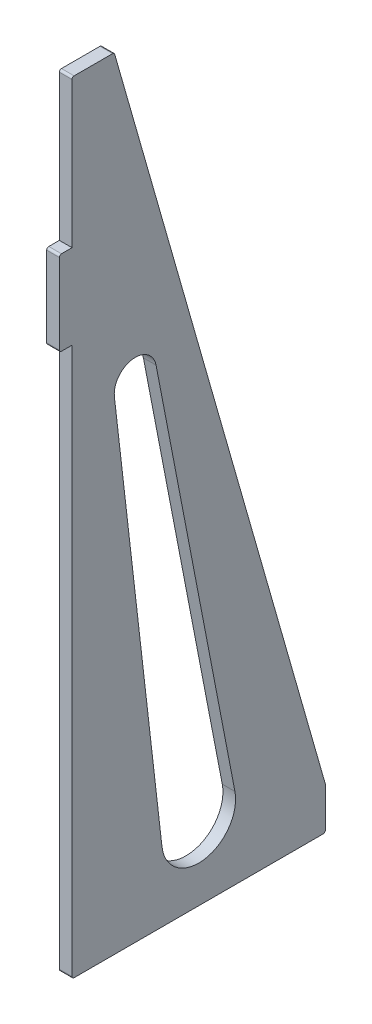
ISO-10303-21;
HEADER;
FILE_DESCRIPTION(('STEP AP214'),'2;1');
FILE_NAME('part.step','',(''),(''),'','','');
FILE_SCHEMA(('AUTOMOTIVE_DESIGN { 1 0 10303 214 1 1 1 1 }'));
ENDSEC;
DATA;
#1=APPLICATION_CONTEXT('core data for automotive mechanical design processes');
#2=APPLICATION_PROTOCOL_DEFINITION('international standard','automotive_design',2000,#1);
#3=PRODUCT_CONTEXT('',#1,'mechanical');
#4=PRODUCT('Part','Part','',(#3));
#5=PRODUCT_RELATED_PRODUCT_CATEGORY('part','',(#4));
#6=PRODUCT_DEFINITION_FORMATION('','',#4);
#7=PRODUCT_DEFINITION_CONTEXT('part definition',#1,'design');
#8=PRODUCT_DEFINITION('design','',#6,#7);
#9=PRODUCT_DEFINITION_SHAPE('','',#8);
#10=(LENGTH_UNIT() NAMED_UNIT(*) SI_UNIT(.MILLI.,.METRE.));
#11=(NAMED_UNIT(*) PLANE_ANGLE_UNIT() SI_UNIT($,.RADIAN.));
#12=(NAMED_UNIT(*) SI_UNIT($,.STERADIAN.) SOLID_ANGLE_UNIT());
#13=UNCERTAINTY_MEASURE_WITH_UNIT(LENGTH_MEASURE(1.E-05),#10,'distance_accuracy_value','');
#14=(GEOMETRIC_REPRESENTATION_CONTEXT(3) GLOBAL_UNCERTAINTY_ASSIGNED_CONTEXT((#13)) GLOBAL_UNIT_ASSIGNED_CONTEXT((#10,
#11,#12)) REPRESENTATION_CONTEXT('',''));
#15=CARTESIAN_POINT('',(0.,0.,0.));
#16=DIRECTION('',(0.,0.,1.));
#17=DIRECTION('',(1.,0.,0.));
#18=AXIS2_PLACEMENT_3D('',#15,#16,#17);
#19=CARTESIAN_POINT('',(6.,0.,-126.));
#20=DIRECTION('',(0.,1.,0.));
#21=DIRECTION('',(0.,0.,1.));
#22=AXIS2_PLACEMENT_3D('',#19,#20,#21);
#23=PLANE('',#22);
#24=DIRECTION('',(0.,0.,-1.));
#25=VECTOR('',#24,1.);
#26=CARTESIAN_POINT('',(0.,0.,-126.));
#27=LINE('',#26,#25);
#28=CARTESIAN_POINT('',(0.,0.,-7.00000000000005));
#29=VERTEX_POINT('',#28);
#30=CARTESIAN_POINT('',(0.,0.,-125.));
#31=VERTEX_POINT('',#30);
#32=EDGE_CURVE('E219',#29,#31,#27,.T.);
#33=ORIENTED_EDGE('',*,*,#32,.T.);
#34=DIRECTION('',(-1.,0.,0.));
#35=VECTOR('',#34,1.);
#36=CARTESIAN_POINT('',(6.,0.,-125.));
#37=LINE('',#36,#35);
#38=CARTESIAN_POINT('',(6.,0.,-125.));
#39=VERTEX_POINT('',#38);
#40=EDGE_CURVE('E299',#31,#39,#37,.F.);
#41=ORIENTED_EDGE('',*,*,#40,.T.);
#42=DIRECTION('',(0.,0.,-1.));
#43=VECTOR('',#42,1.);
#44=CARTESIAN_POINT('',(6.,0.,-126.));
#45=LINE('',#44,#43);
#46=CARTESIAN_POINT('',(6.,0.,-7.00000000000005));
#47=VERTEX_POINT('',#46);
#48=EDGE_CURVE('E220',#47,#39,#45,.T.);
#49=ORIENTED_EDGE('',*,*,#48,.F.);
#50=DIRECTION('',(1.,0.,0.));
#51=VECTOR('',#50,1.);
#52=CARTESIAN_POINT('',(6.,0.,-7.00000000000005));
#53=LINE('',#52,#51);
#54=EDGE_CURVE('E297',#47,#29,#53,.F.);
#55=ORIENTED_EDGE('',*,*,#54,.T.);
#56=EDGE_LOOP('',(#33,#41,#49,#55));
#57=FACE_BOUND('',#56,.T.);
#58=ADVANCED_FACE('F31',(#57),#23,.F.);
#59=CARTESIAN_POINT('',(6.,20.,-126.));
#60=DIRECTION('',(0.,0.,1.));
#61=DIRECTION('',(1.,0.,0.));
#62=AXIS2_PLACEMENT_3D('',#59,#60,#61);
#63=PLANE('',#62);
#64=DIRECTION('',(0.,1.,0.));
#65=VECTOR('',#64,1.);
#66=CARTESIAN_POINT('',(0.,20.,-126.));
#67=LINE('',#66,#65);
#68=CARTESIAN_POINT('',(0.,1.,-126.));
#69=VERTEX_POINT('',#68);
#70=CARTESIAN_POINT('',(0.,19.8599450553598,-126.));
#71=VERTEX_POINT('',#70);
#72=EDGE_CURVE('E239',#69,#71,#67,.T.);
#73=ORIENTED_EDGE('',*,*,#72,.T.);
#74=DIRECTION('',(-1.,0.,0.));
#75=VECTOR('',#74,1.);
#76=CARTESIAN_POINT('',(6.,19.8599450553598,-126.));
#77=LINE('',#76,#75);
#78=CARTESIAN_POINT('',(6.,19.8599450553598,-126.));
#79=VERTEX_POINT('',#78);
#80=EDGE_CURVE('E281',#71,#79,#77,.F.);
#81=ORIENTED_EDGE('',*,*,#80,.T.);
#82=DIRECTION('',(0.,1.,0.));
#83=VECTOR('',#82,1.);
#84=CARTESIAN_POINT('',(6.,20.,-126.));
#85=LINE('',#84,#83);
#86=CARTESIAN_POINT('',(6.,1.,-126.));
#87=VERTEX_POINT('',#86);
#88=EDGE_CURVE('E223',#87,#79,#85,.T.);
#89=ORIENTED_EDGE('',*,*,#88,.F.);
#90=DIRECTION('',(-1.,0.,0.));
#91=VECTOR('',#90,1.);
#92=CARTESIAN_POINT('',(6.,1.,-126.));
#93=LINE('',#92,#91);
#94=EDGE_CURVE('E278',#87,#69,#93,.T.);
#95=ORIENTED_EDGE('',*,*,#94,.T.);
#96=EDGE_LOOP('',(#73,#81,#89,#95));
#97=FACE_BOUND('',#96,.T.);
#98=ADVANCED_FACE('F344',(#97),#63,.F.);
#99=CARTESIAN_POINT('',(6.,370.,-26.));
#100=DIRECTION('',(0.,-0.274721127897378,0.961523947640823));
#101=DIRECTION('',(0.,-0.961523947640823,-0.274721127897378));
#102=AXIS2_PLACEMENT_3D('',#99,#100,#101);
#103=PLANE('',#102);
#104=DIRECTION('',(0.,0.961523947640823,0.274721127897378));
#105=VECTOR('',#104,1.);
#106=CARTESIAN_POINT('',(6.,370.,-26.));
#107=LINE('',#106,#105);
#108=CARTESIAN_POINT('',(6.,20.1346661832571,-125.961523947641));
#109=VERTEX_POINT('',#108);
#110=CARTESIAN_POINT('',(6.,369.274721127897,-26.2072225348865));
#111=VERTEX_POINT('',#110);
#112=EDGE_CURVE('E227',#109,#111,#107,.T.);
#113=ORIENTED_EDGE('',*,*,#112,.F.);
#114=DIRECTION('',(-1.,0.,0.));
#115=VECTOR('',#114,1.);
#116=CARTESIAN_POINT('',(6.,20.1346661832572,-125.961523947641));
#117=LINE('',#116,#115);
#118=CARTESIAN_POINT('',(0.,20.1346661832571,-125.961523947641));
#119=VERTEX_POINT('',#118);
#120=EDGE_CURVE('E261',#109,#119,#117,.T.);
#121=ORIENTED_EDGE('',*,*,#120,.T.);
#122=DIRECTION('',(0.,0.961523947640823,0.274721127897378));
#123=VECTOR('',#122,1.);
#124=CARTESIAN_POINT('',(0.,370.,-26.));
#125=LINE('',#124,#123);
#126=CARTESIAN_POINT('',(0.,369.274721127897,-26.2072225348865));
#127=VERTEX_POINT('',#126);
#128=EDGE_CURVE('E242',#119,#127,#125,.T.);
#129=ORIENTED_EDGE('',*,*,#128,.T.);
#130=DIRECTION('',(-1.,0.,0.));
#131=VECTOR('',#130,1.);
#132=CARTESIAN_POINT('',(6.,369.274721127897,-26.2072225348865));
#133=LINE('',#132,#131);
#134=EDGE_CURVE('E259',#127,#111,#133,.F.);
#135=ORIENTED_EDGE('',*,*,#134,.T.);
#136=EDGE_LOOP('',(#113,#121,#129,#135));
#137=FACE_BOUND('',#136,.T.);
#138=ADVANCED_FACE('F338',(#137),#103,.F.);
#139=CARTESIAN_POINT('',(6.,370.,0.));
#140=DIRECTION('',(0.,-1.,0.));
#141=DIRECTION('',(0.,0.,-1.));
#142=AXIS2_PLACEMENT_3D('',#139,#140,#141);
#143=PLANE('',#142);
#144=DIRECTION('',(0.,0.,1.));
#145=VECTOR('',#144,1.);
#146=CARTESIAN_POINT('',(6.,370.,0.));
#147=LINE('',#146,#145);
#148=CARTESIAN_POINT('',(6.,370.,-25.2456985872456));
#149=VERTEX_POINT('',#148);
#150=CARTESIAN_POINT('',(6.,370.,-7.));
#151=VERTEX_POINT('',#150);
#152=EDGE_CURVE('E230',#149,#151,#147,.T.);
#153=ORIENTED_EDGE('',*,*,#152,.F.);
#154=DIRECTION('',(-1.,0.,0.));
#155=VECTOR('',#154,1.);
#156=CARTESIAN_POINT('',(6.,370.,-25.2456985872456));
#157=LINE('',#156,#155);
#158=CARTESIAN_POINT('',(0.,370.,-25.2456985872456));
#159=VERTEX_POINT('',#158);
#160=EDGE_CURVE('E39',#149,#159,#157,.T.);
#161=ORIENTED_EDGE('',*,*,#160,.T.);
#162=DIRECTION('',(0.,0.,1.));
#163=VECTOR('',#162,1.);
#164=CARTESIAN_POINT('',(0.,370.,0.));
#165=LINE('',#164,#163);
#166=CARTESIAN_POINT('',(0.,370.,-7.));
#167=VERTEX_POINT('',#166);
#168=EDGE_CURVE('E245',#159,#167,#165,.T.);
#169=ORIENTED_EDGE('',*,*,#168,.T.);
#170=DIRECTION('',(1.,0.,0.));
#171=VECTOR('',#170,1.);
#172=CARTESIAN_POINT('',(6.,370.,-7.));
#173=LINE('',#172,#171);
#174=EDGE_CURVE('E314',#167,#151,#173,.T.);
#175=ORIENTED_EDGE('',*,*,#174,.T.);
#176=EDGE_LOOP('',(#153,#161,#169,#175));
#177=FACE_BOUND('',#176,.T.);
#178=ADVANCED_FACE('F321',(#177),#143,.F.);
#179=CARTESIAN_POINT('',(6.,0.,0.));
#180=DIRECTION('',(0.,0.,-1.));
#181=DIRECTION('',(-1.,0.,0.));
#182=AXIS2_PLACEMENT_3D('',#179,#180,#181);
#183=PLANE('',#182);
#184=DIRECTION('',(0.,-1.,0.));
#185=VECTOR('',#184,1.);
#186=CARTESIAN_POINT('',(0.,0.,0.));
#187=LINE('',#186,#185);
#188=CARTESIAN_POINT('',(0.,299.,0.));
#189=VERTEX_POINT('',#188);
#190=CARTESIAN_POINT('',(0.,261.,0.));
#191=VERTEX_POINT('',#190);
#192=EDGE_CURVE('E224',#189,#191,#187,.T.);
#193=ORIENTED_EDGE('',*,*,#192,.T.);
#194=DIRECTION('',(1.,0.,0.));
#195=VECTOR('',#194,1.);
#196=CARTESIAN_POINT('',(6.,261.,0.));
#197=LINE('',#196,#195);
#198=CARTESIAN_POINT('',(6.,261.,0.));
#199=VERTEX_POINT('',#198);
#200=EDGE_CURVE('E306',#191,#199,#197,.T.);
#201=ORIENTED_EDGE('',*,*,#200,.T.);
#202=DIRECTION('',(0.,-1.,0.));
#203=VECTOR('',#202,1.);
#204=CARTESIAN_POINT('',(6.,0.,0.));
#205=LINE('',#204,#203);
#206=CARTESIAN_POINT('',(6.,299.,0.));
#207=VERTEX_POINT('',#206);
#208=EDGE_CURVE('E233',#207,#199,#205,.T.);
#209=ORIENTED_EDGE('',*,*,#208,.F.);
#210=DIRECTION('',(1.,0.,0.));
#211=VECTOR('',#210,1.);
#212=CARTESIAN_POINT('',(6.,299.,0.));
#213=LINE('',#212,#211);
#214=EDGE_CURVE('E304',#207,#189,#213,.F.);
#215=ORIENTED_EDGE('',*,*,#214,.T.);
#216=EDGE_LOOP('',(#193,#201,#209,#215));
#217=FACE_BOUND('',#216,.T.);
#218=ADVANCED_FACE('F377',(#217),#183,.F.);
#219=CARTESIAN_POINT('',(6.,0.,0.));
#220=DIRECTION('',(-1.,0.,0.));
#221=DIRECTION('',(0.,0.,1.));
#222=AXIS2_PLACEMENT_3D('',#219,#220,#221);
#223=PLANE('',#222);
#224=DIRECTION('',(0.,0.981876951244127,0.189519530960635));
#225=VECTOR('',#224,1.);
#226=CARTESIAN_POINT('',(6.,231.895195309606,-45.8187695124413));
#227=LINE('',#226,#225);
#228=CARTESIAN_POINT('',(6.,38.3165917918111,-83.1828466467722));
#229=VERTEX_POINT('',#228);
#230=CARTESIAN_POINT('',(6.,231.895195309606,-45.8187695124413));
#231=VERTEX_POINT('',#230);
#232=EDGE_CURVE('E194',#229,#231,#227,.T.);
#233=ORIENTED_EDGE('',*,*,#232,.F.);
#234=CARTESIAN_POINT('',(6.,35.,-66.));
#235=DIRECTION('',(1.,0.,0.));
#236=DIRECTION('',(0.,0.,1.));
#237=AXIS2_PLACEMENT_3D('',#234,#235,#236);
#238=CIRCLE('',#237,17.5);
#239=CARTESIAN_POINT('',(6.,32.998437109923,-48.6148412144994));
#240=VERTEX_POINT('',#239);
#241=EDGE_CURVE('E46',#240,#229,#238,.T.);
#242=ORIENTED_EDGE('',*,*,#241,.F.);
#243=DIRECTION('',(0.,-0.993437644885745,-0.114375022290115));
#244=VECTOR('',#243,1.);
#245=CARTESIAN_POINT('',(6.,228.856249777099,-26.0656235511425));
#246=LINE('',#245,#244);
#247=CARTESIAN_POINT('',(6.,228.856249777099,-26.0656235511425));
#248=VERTEX_POINT('',#247);
#249=EDGE_CURVE('E185',#248,#240,#246,.T.);
#250=ORIENTED_EDGE('',*,*,#249,.F.);
#251=CARTESIAN_POINT('',(6.,230.,-36.));
#252=DIRECTION('',(1.,0.,0.));
#253=DIRECTION('',(0.,0.,1.));
#254=AXIS2_PLACEMENT_3D('',#251,#252,#253);
#255=CIRCLE('',#254,10.);
#256=EDGE_CURVE('E188',#231,#248,#255,.T.);
#257=ORIENTED_EDGE('',*,*,#256,.F.);
#258=EDGE_LOOP('',(#233,#242,#250,#257));
#259=FACE_BOUND('',#258,.T.);
#260=ORIENTED_EDGE('',*,*,#88,.T.);
#261=CARTESIAN_POINT('',(6.,19.8599450553598,-125.));
#262=DIRECTION('',(-1.,0.,0.));
#263=DIRECTION('',(0.,0.,1.));
#264=AXIS2_PLACEMENT_3D('',#261,#262,#263);
#265=CIRCLE('',#264,1.);
#266=EDGE_CURVE('E295',#79,#109,#265,.F.);
#267=ORIENTED_EDGE('',*,*,#266,.T.);
#268=ORIENTED_EDGE('',*,*,#112,.T.);
#269=CARTESIAN_POINT('',(6.,369.,-25.2456985872456));
#270=DIRECTION('',(-1.,0.,0.));
#271=DIRECTION('',(0.,0.,1.));
#272=AXIS2_PLACEMENT_3D('',#269,#270,#271);
#273=CIRCLE('',#272,1.);
#274=EDGE_CURVE('E285',#111,#149,#273,.F.);
#275=ORIENTED_EDGE('',*,*,#274,.T.);
#276=ORIENTED_EDGE('',*,*,#152,.T.);
#277=CARTESIAN_POINT('',(6.,369.,-7.));
#278=DIRECTION('',(-1.,0.,0.));
#279=DIRECTION('',(0.,0.,1.));
#280=AXIS2_PLACEMENT_3D('',#277,#278,#279);
#281=CIRCLE('',#280,1.);
#282=CARTESIAN_POINT('',(6.,369.,-6.));
#283=VERTEX_POINT('',#282);
#284=EDGE_CURVE('E283',#151,#283,#281,.F.);
#285=ORIENTED_EDGE('',*,*,#284,.T.);
#286=DIRECTION('',(0.,1.,0.));
#287=VECTOR('',#286,1.);
#288=CARTESIAN_POINT('',(6.,370.,-6.));
#289=LINE('',#288,#287);
#290=CARTESIAN_POINT('',(6.,300.,-6.00000000000001));
#291=VERTEX_POINT('',#290);
#292=EDGE_CURVE('E213',#291,#283,#289,.T.);
#293=ORIENTED_EDGE('',*,*,#292,.F.);
#294=DIRECTION('',(0.,0.,-1.));
#295=VECTOR('',#294,1.);
#296=CARTESIAN_POINT('',(6.,300.,-6.00000000000001));
#297=LINE('',#296,#295);
#298=CARTESIAN_POINT('',(6.,300.,-1.));
#299=VERTEX_POINT('',#298);
#300=EDGE_CURVE('E211',#299,#291,#297,.T.);
#301=ORIENTED_EDGE('',*,*,#300,.F.);
#302=CARTESIAN_POINT('',(6.,299.,-1.));
#303=DIRECTION('',(-1.,0.,0.));
#304=DIRECTION('',(0.,0.,1.));
#305=AXIS2_PLACEMENT_3D('',#302,#303,#304);
#306=CIRCLE('',#305,1.);
#307=EDGE_CURVE('E287',#299,#207,#306,.F.);
#308=ORIENTED_EDGE('',*,*,#307,.T.);
#309=ORIENTED_EDGE('',*,*,#208,.T.);
#310=CARTESIAN_POINT('',(6.,261.,-1.));
#311=DIRECTION('',(-1.,0.,0.));
#312=DIRECTION('',(0.,0.,1.));
#313=AXIS2_PLACEMENT_3D('',#310,#311,#312);
#314=CIRCLE('',#313,1.);
#315=CARTESIAN_POINT('',(6.,260.,-1.));
#316=VERTEX_POINT('',#315);
#317=EDGE_CURVE('E289',#199,#316,#314,.F.);
#318=ORIENTED_EDGE('',*,*,#317,.T.);
#319=DIRECTION('',(0.,0.,1.));
#320=VECTOR('',#319,1.);
#321=CARTESIAN_POINT('',(6.,260.,0.));
#322=LINE('',#321,#320);
#323=CARTESIAN_POINT('',(6.,260.,-6.00000000000001));
#324=VERTEX_POINT('',#323);
#325=EDGE_CURVE('E205',#324,#316,#322,.T.);
#326=ORIENTED_EDGE('',*,*,#325,.F.);
#327=DIRECTION('',(0.,1.,0.));
#328=VECTOR('',#327,1.);
#329=CARTESIAN_POINT('',(6.,260.,-6.00000000000001));
#330=LINE('',#329,#328);
#331=CARTESIAN_POINT('',(6.,1.,-6.00000000000004));
#332=VERTEX_POINT('',#331);
#333=EDGE_CURVE('E200',#332,#324,#330,.T.);
#334=ORIENTED_EDGE('',*,*,#333,.F.);
#335=CARTESIAN_POINT('',(6.,1.,-7.00000000000004));
#336=DIRECTION('',(-1.,0.,0.));
#337=DIRECTION('',(0.,0.,1.));
#338=AXIS2_PLACEMENT_3D('',#335,#336,#337);
#339=CIRCLE('',#338,1.);
#340=EDGE_CURVE('E291',#332,#47,#339,.F.);
#341=ORIENTED_EDGE('',*,*,#340,.T.);
#342=ORIENTED_EDGE('',*,*,#48,.T.);
#343=CARTESIAN_POINT('',(6.,1.,-125.));
#344=DIRECTION('',(-1.,0.,0.));
#345=DIRECTION('',(0.,0.,1.));
#346=AXIS2_PLACEMENT_3D('',#343,#344,#345);
#347=CIRCLE('',#346,1.);
#348=EDGE_CURVE('E293',#39,#87,#347,.F.);
#349=ORIENTED_EDGE('',*,*,#348,.T.);
#350=EDGE_LOOP('',(#260,#267,#268,#275,#276,#285,#293,#301,#308,#309,#318,#326,#334,#341,#342,#349));
#351=FACE_BOUND('',#350,.T.);
#352=ADVANCED_FACE('F332',(#259,#351),#223,.F.);
#353=CARTESIAN_POINT('',(0.,0.,0.));
#354=DIRECTION('',(-1.,0.,0.));
#355=DIRECTION('',(0.,0.,1.));
#356=AXIS2_PLACEMENT_3D('',#353,#354,#355);
#357=PLANE('',#356);
#358=CARTESIAN_POINT('',(0.,35.,-66.));
#359=DIRECTION('',(1.,0.,0.));
#360=DIRECTION('',(0.,0.,1.));
#361=AXIS2_PLACEMENT_3D('',#358,#359,#360);
#362=CIRCLE('',#361,17.5);
#363=CARTESIAN_POINT('',(0.,32.998437109923,-48.6148412144994));
#364=VERTEX_POINT('',#363);
#365=CARTESIAN_POINT('',(0.,38.3165917918111,-83.1828466467722));
#366=VERTEX_POINT('',#365);
#367=EDGE_CURVE('E169',#364,#366,#362,.T.);
#368=ORIENTED_EDGE('',*,*,#367,.T.);
#369=DIRECTION('',(0.,0.981876951244127,0.189519530960635));
#370=VECTOR('',#369,1.);
#371=CARTESIAN_POINT('',(0.,231.895195309606,-45.8187695124413));
#372=LINE('',#371,#370);
#373=CARTESIAN_POINT('',(0.,231.895195309606,-45.8187695124413));
#374=VERTEX_POINT('',#373);
#375=EDGE_CURVE('E178',#366,#374,#372,.T.);
#376=ORIENTED_EDGE('',*,*,#375,.T.);
#377=CARTESIAN_POINT('',(0.,230.,-36.));
#378=DIRECTION('',(1.,0.,0.));
#379=DIRECTION('',(0.,0.,1.));
#380=AXIS2_PLACEMENT_3D('',#377,#378,#379);
#381=CIRCLE('',#380,10.);
#382=CARTESIAN_POINT('',(0.,228.856249777099,-26.0656235511425));
#383=VERTEX_POINT('',#382);
#384=EDGE_CURVE('E54',#374,#383,#381,.T.);
#385=ORIENTED_EDGE('',*,*,#384,.T.);
#386=DIRECTION('',(0.,-0.993437644885745,-0.114375022290115));
#387=VECTOR('',#386,1.);
#388=CARTESIAN_POINT('',(0.,228.856249777099,-26.0656235511425));
#389=LINE('',#388,#387);
#390=EDGE_CURVE('E175',#383,#364,#389,.T.);
#391=ORIENTED_EDGE('',*,*,#390,.T.);
#392=EDGE_LOOP('',(#368,#376,#385,#391));
#393=FACE_BOUND('',#392,.T.);
#394=ORIENTED_EDGE('',*,*,#128,.F.);
#395=CARTESIAN_POINT('',(0.,19.8599450553598,-125.));
#396=DIRECTION('',(-1.,0.,0.));
#397=DIRECTION('',(0.,0.,1.));
#398=AXIS2_PLACEMENT_3D('',#395,#396,#397);
#399=CIRCLE('',#398,1.);
#400=EDGE_CURVE('E276',#119,#71,#399,.T.);
#401=ORIENTED_EDGE('',*,*,#400,.T.);
#402=ORIENTED_EDGE('',*,*,#72,.F.);
#403=CARTESIAN_POINT('',(0.,1.,-125.));
#404=DIRECTION('',(-1.,0.,0.));
#405=DIRECTION('',(0.,0.,1.));
#406=AXIS2_PLACEMENT_3D('',#403,#404,#405);
#407=CIRCLE('',#406,1.);
#408=EDGE_CURVE('E274',#69,#31,#407,.T.);
#409=ORIENTED_EDGE('',*,*,#408,.T.);
#410=ORIENTED_EDGE('',*,*,#32,.F.);
#411=CARTESIAN_POINT('',(0.,1.,-7.00000000000004));
#412=DIRECTION('',(-1.,0.,0.));
#413=DIRECTION('',(0.,0.,1.));
#414=AXIS2_PLACEMENT_3D('',#411,#412,#413);
#415=CIRCLE('',#414,1.);
#416=CARTESIAN_POINT('',(0.,1.,-6.00000000000004));
#417=VERTEX_POINT('',#416);
#418=EDGE_CURVE('E272',#29,#417,#415,.T.);
#419=ORIENTED_EDGE('',*,*,#418,.T.);
#420=DIRECTION('',(0.,-1.,0.));
#421=VECTOR('',#420,1.);
#422=CARTESIAN_POINT('',(0.,0.,-6.00000000000004));
#423=LINE('',#422,#421);
#424=CARTESIAN_POINT('',(0.,260.,-6.00000000000001));
#425=VERTEX_POINT('',#424);
#426=EDGE_CURVE('E254',#425,#417,#423,.T.);
#427=ORIENTED_EDGE('',*,*,#426,.F.);
#428=DIRECTION('',(0.,0.,-1.));
#429=VECTOR('',#428,1.);
#430=CARTESIAN_POINT('',(0.,260.,0.));
#431=LINE('',#430,#429);
#432=CARTESIAN_POINT('',(0.,260.,-1.));
#433=VERTEX_POINT('',#432);
#434=EDGE_CURVE('E257',#433,#425,#431,.T.);
#435=ORIENTED_EDGE('',*,*,#434,.F.);
#436=CARTESIAN_POINT('',(0.,261.,-1.));
#437=DIRECTION('',(-1.,0.,0.));
#438=DIRECTION('',(0.,0.,1.));
#439=AXIS2_PLACEMENT_3D('',#436,#437,#438);
#440=CIRCLE('',#439,1.);
#441=EDGE_CURVE('E270',#433,#191,#440,.T.);
#442=ORIENTED_EDGE('',*,*,#441,.T.);
#443=ORIENTED_EDGE('',*,*,#192,.F.);
#444=CARTESIAN_POINT('',(0.,299.,-1.));
#445=DIRECTION('',(-1.,0.,0.));
#446=DIRECTION('',(0.,0.,1.));
#447=AXIS2_PLACEMENT_3D('',#444,#445,#446);
#448=CIRCLE('',#447,1.);
#449=CARTESIAN_POINT('',(0.,300.,-1.));
#450=VERTEX_POINT('',#449);
#451=EDGE_CURVE('E268',#189,#450,#448,.T.);
#452=ORIENTED_EDGE('',*,*,#451,.T.);
#453=DIRECTION('',(0.,0.,1.));
#454=VECTOR('',#453,1.);
#455=CARTESIAN_POINT('',(0.,300.,0.));
#456=LINE('',#455,#454);
#457=CARTESIAN_POINT('',(0.,300.,-6.00000000000001));
#458=VERTEX_POINT('',#457);
#459=EDGE_CURVE('E236',#458,#450,#456,.T.);
#460=ORIENTED_EDGE('',*,*,#459,.F.);
#461=DIRECTION('',(0.,-1.,0.));
#462=VECTOR('',#461,1.);
#463=CARTESIAN_POINT('',(0.,0.,-6.00000000000005));
#464=LINE('',#463,#462);
#465=CARTESIAN_POINT('',(0.,369.,-6.));
#466=VERTEX_POINT('',#465);
#467=EDGE_CURVE('E252',#466,#458,#464,.T.);
#468=ORIENTED_EDGE('',*,*,#467,.F.);
#469=CARTESIAN_POINT('',(0.,369.,-7.));
#470=DIRECTION('',(-1.,0.,0.));
#471=DIRECTION('',(0.,0.,1.));
#472=AXIS2_PLACEMENT_3D('',#469,#470,#471);
#473=CIRCLE('',#472,1.);
#474=EDGE_CURVE('E264',#466,#167,#473,.T.);
#475=ORIENTED_EDGE('',*,*,#474,.T.);
#476=ORIENTED_EDGE('',*,*,#168,.F.);
#477=CARTESIAN_POINT('',(0.,369.,-25.2456985872456));
#478=DIRECTION('',(-1.,0.,0.));
#479=DIRECTION('',(0.,0.,1.));
#480=AXIS2_PLACEMENT_3D('',#477,#478,#479);
#481=CIRCLE('',#480,1.);
#482=EDGE_CURVE('E266',#159,#127,#481,.T.);
#483=ORIENTED_EDGE('',*,*,#482,.T.);
#484=EDGE_LOOP('',(#394,#401,#402,#409,#410,#419,#427,#435,#442,#443,#452,#460,#468,#475,#476,#483));
#485=FACE_BOUND('',#484,.T.);
#486=ADVANCED_FACE('F182',(#393,#485),#357,.T.);
#487=CARTESIAN_POINT('',(-4.,370.,-6.));
#488=DIRECTION('',(0.,0.,-1.));
#489=DIRECTION('',(0.,1.,0.));
#490=AXIS2_PLACEMENT_3D('',#487,#488,#489);
#491=PLANE('',#490);
#492=ORIENTED_EDGE('',*,*,#292,.T.);
#493=DIRECTION('',(1.,0.,0.));
#494=VECTOR('',#493,1.);
#495=CARTESIAN_POINT('',(-4.,369.,-6.));
#496=LINE('',#495,#494);
#497=EDGE_CURVE('E11',#283,#466,#496,.F.);
#498=ORIENTED_EDGE('',*,*,#497,.T.);
#499=ORIENTED_EDGE('',*,*,#467,.T.);
#500=DIRECTION('',(1.,0.,0.));
#501=VECTOR('',#500,1.);
#502=CARTESIAN_POINT('',(-4.,300.,-6.00000000000001));
#503=LINE('',#502,#501);
#504=EDGE_CURVE('E216',#458,#291,#503,.T.);
#505=ORIENTED_EDGE('',*,*,#504,.T.);
#506=EDGE_LOOP('',(#492,#498,#499,#505));
#507=FACE_BOUND('',#506,.T.);
#508=ADVANCED_FACE('F389',(#507),#491,.F.);
#509=CARTESIAN_POINT('',(-4.,300.,-6.00000000000001));
#510=DIRECTION('',(0.,-1.,0.));
#511=DIRECTION('',(0.,0.,-1.));
#512=AXIS2_PLACEMENT_3D('',#509,#510,#511);
#513=PLANE('',#512);
#514=ORIENTED_EDGE('',*,*,#459,.T.);
#515=DIRECTION('',(1.,0.,0.));
#516=VECTOR('',#515,1.);
#517=CARTESIAN_POINT('',(-4.,300.,-1.));
#518=LINE('',#517,#516);
#519=EDGE_CURVE('E311',#450,#299,#518,.T.);
#520=ORIENTED_EDGE('',*,*,#519,.T.);
#521=ORIENTED_EDGE('',*,*,#300,.T.);
#522=ORIENTED_EDGE('',*,*,#504,.F.);
#523=EDGE_LOOP('',(#514,#520,#521,#522));
#524=FACE_BOUND('',#523,.T.);
#525=ADVANCED_FACE('F386',(#524),#513,.F.);
#526=CARTESIAN_POINT('',(-4.,260.,0.));
#527=DIRECTION('',(0.,1.,0.));
#528=DIRECTION('',(0.,0.,1.));
#529=AXIS2_PLACEMENT_3D('',#526,#527,#528);
#530=PLANE('',#529);
#531=ORIENTED_EDGE('',*,*,#325,.T.);
#532=DIRECTION('',(1.,0.,0.));
#533=VECTOR('',#532,1.);
#534=CARTESIAN_POINT('',(-4.,260.,-1.));
#535=LINE('',#534,#533);
#536=EDGE_CURVE('E309',#316,#433,#535,.F.);
#537=ORIENTED_EDGE('',*,*,#536,.T.);
#538=ORIENTED_EDGE('',*,*,#434,.T.);
#539=DIRECTION('',(1.,0.,0.));
#540=VECTOR('',#539,1.);
#541=CARTESIAN_POINT('',(-4.,260.,-6.00000000000001));
#542=LINE('',#541,#540);
#543=EDGE_CURVE('E208',#425,#324,#542,.T.);
#544=ORIENTED_EDGE('',*,*,#543,.T.);
#545=EDGE_LOOP('',(#531,#537,#538,#544));
#546=FACE_BOUND('',#545,.T.);
#547=ADVANCED_FACE('F369',(#546),#530,.F.);
#548=CARTESIAN_POINT('',(-4.,260.,-6.00000000000001));
#549=DIRECTION('',(0.,0.,-1.));
#550=DIRECTION('',(0.,1.,0.));
#551=AXIS2_PLACEMENT_3D('',#548,#549,#550);
#552=PLANE('',#551);
#553=ORIENTED_EDGE('',*,*,#426,.T.);
#554=DIRECTION('',(1.,0.,0.));
#555=VECTOR('',#554,1.);
#556=CARTESIAN_POINT('',(-4.,1.,-6.00000000000004));
#557=LINE('',#556,#555);
#558=EDGE_CURVE('E301',#417,#332,#557,.T.);
#559=ORIENTED_EDGE('',*,*,#558,.T.);
#560=ORIENTED_EDGE('',*,*,#333,.T.);
#561=ORIENTED_EDGE('',*,*,#543,.F.);
#562=EDGE_LOOP('',(#553,#559,#560,#561));
#563=FACE_BOUND('',#562,.T.);
#564=ADVANCED_FACE('F365',(#563),#552,.F.);
#565=CARTESIAN_POINT('',(6.,19.8599450553598,-125.));
#566=DIRECTION('',(-1.,0.,0.));
#567=DIRECTION('',(0.,0.,1.));
#568=AXIS2_PLACEMENT_3D('',#565,#566,#567);
#569=CYLINDRICAL_SURFACE('',#568,1.);
#570=ORIENTED_EDGE('',*,*,#266,.F.);
#571=ORIENTED_EDGE('',*,*,#80,.F.);
#572=ORIENTED_EDGE('',*,*,#400,.F.);
#573=ORIENTED_EDGE('',*,*,#120,.F.);
#574=EDGE_LOOP('',(#570,#571,#572,#573));
#575=FACE_BOUND('',#574,.T.);
#576=ADVANCED_FACE('F348',(#575),#569,.T.);
#577=CARTESIAN_POINT('',(6.,1.,-125.));
#578=DIRECTION('',(-1.,0.,0.));
#579=DIRECTION('',(0.,0.,1.));
#580=AXIS2_PLACEMENT_3D('',#577,#578,#579);
#581=CYLINDRICAL_SURFACE('',#580,1.);
#582=ORIENTED_EDGE('',*,*,#348,.F.);
#583=ORIENTED_EDGE('',*,*,#40,.F.);
#584=ORIENTED_EDGE('',*,*,#408,.F.);
#585=ORIENTED_EDGE('',*,*,#94,.F.);
#586=EDGE_LOOP('',(#582,#583,#584,#585));
#587=FACE_BOUND('',#586,.T.);
#588=ADVANCED_FACE('F351',(#587),#581,.T.);
#589=CARTESIAN_POINT('',(-4.,1.,-7.00000000000004));
#590=DIRECTION('',(1.,0.,0.));
#591=DIRECTION('',(0.,0.,-1.));
#592=AXIS2_PLACEMENT_3D('',#589,#590,#591);
#593=CYLINDRICAL_SURFACE('',#592,1.);
#594=ORIENTED_EDGE('',*,*,#418,.F.);
#595=ORIENTED_EDGE('',*,*,#54,.F.);
#596=ORIENTED_EDGE('',*,*,#340,.F.);
#597=ORIENTED_EDGE('',*,*,#558,.F.);
#598=EDGE_LOOP('',(#594,#595,#596,#597));
#599=FACE_BOUND('',#598,.T.);
#600=ADVANCED_FACE('F359',(#599),#593,.T.);
#601=CARTESIAN_POINT('',(6.,261.,-1.));
#602=DIRECTION('',(1.,0.,0.));
#603=DIRECTION('',(0.,0.,-1.));
#604=AXIS2_PLACEMENT_3D('',#601,#602,#603);
#605=CYLINDRICAL_SURFACE('',#604,1.);
#606=ORIENTED_EDGE('',*,*,#441,.F.);
#607=ORIENTED_EDGE('',*,*,#536,.F.);
#608=ORIENTED_EDGE('',*,*,#317,.F.);
#609=ORIENTED_EDGE('',*,*,#200,.F.);
#610=EDGE_LOOP('',(#606,#607,#608,#609));
#611=FACE_BOUND('',#610,.T.);
#612=ADVANCED_FACE('F375',(#611),#605,.T.);
#613=CARTESIAN_POINT('',(-4.,299.,-1.));
#614=DIRECTION('',(1.,0.,0.));
#615=DIRECTION('',(0.,0.,-1.));
#616=AXIS2_PLACEMENT_3D('',#613,#614,#615);
#617=CYLINDRICAL_SURFACE('',#616,1.);
#618=ORIENTED_EDGE('',*,*,#451,.F.);
#619=ORIENTED_EDGE('',*,*,#214,.F.);
#620=ORIENTED_EDGE('',*,*,#307,.F.);
#621=ORIENTED_EDGE('',*,*,#519,.F.);
#622=EDGE_LOOP('',(#618,#619,#620,#621));
#623=FACE_BOUND('',#622,.T.);
#624=ADVANCED_FACE('F383',(#623),#617,.T.);
#625=CARTESIAN_POINT('',(6.,369.,-25.2456985872456));
#626=DIRECTION('',(-1.,0.,0.));
#627=DIRECTION('',(0.,0.,1.));
#628=AXIS2_PLACEMENT_3D('',#625,#626,#627);
#629=CYLINDRICAL_SURFACE('',#628,1.);
#630=ORIENTED_EDGE('',*,*,#274,.F.);
#631=ORIENTED_EDGE('',*,*,#134,.F.);
#632=ORIENTED_EDGE('',*,*,#482,.F.);
#633=ORIENTED_EDGE('',*,*,#160,.F.);
#634=EDGE_LOOP('',(#630,#631,#632,#633));
#635=FACE_BOUND('',#634,.T.);
#636=ADVANCED_FACE('F336',(#635),#629,.T.);
#637=CARTESIAN_POINT('',(6.,369.,-7.));
#638=DIRECTION('',(1.,0.,0.));
#639=DIRECTION('',(0.,0.,-1.));
#640=AXIS2_PLACEMENT_3D('',#637,#638,#639);
#641=CYLINDRICAL_SURFACE('',#640,1.);
#642=ORIENTED_EDGE('',*,*,#474,.F.);
#643=ORIENTED_EDGE('',*,*,#497,.F.);
#644=ORIENTED_EDGE('',*,*,#284,.F.);
#645=ORIENTED_EDGE('',*,*,#174,.F.);
#646=EDGE_LOOP('',(#642,#643,#644,#645));
#647=FACE_BOUND('',#646,.T.);
#648=ADVANCED_FACE('F33',(#647),#641,.T.);
#649=CARTESIAN_POINT('',(0.,35.,-66.));
#650=DIRECTION('',(1.,0.,0.));
#651=DIRECTION('',(0.,0.,-1.));
#652=AXIS2_PLACEMENT_3D('',#649,#650,#651);
#653=CYLINDRICAL_SURFACE('',#652,17.5);
#654=ORIENTED_EDGE('',*,*,#241,.T.);
#655=DIRECTION('',(1.,0.,0.));
#656=VECTOR('',#655,1.);
#657=CARTESIAN_POINT('',(0.,38.3165917918111,-83.1828466467722));
#658=LINE('',#657,#656);
#659=EDGE_CURVE('E165',#366,#229,#658,.T.);
#660=ORIENTED_EDGE('',*,*,#659,.F.);
#661=ORIENTED_EDGE('',*,*,#367,.F.);
#662=DIRECTION('',(1.,0.,0.));
#663=VECTOR('',#662,1.);
#664=CARTESIAN_POINT('',(0.,32.998437109923,-48.6148412144994));
#665=LINE('',#664,#663);
#666=EDGE_CURVE('E198',#364,#240,#665,.T.);
#667=ORIENTED_EDGE('',*,*,#666,.T.);
#668=EDGE_LOOP('',(#654,#660,#661,#667));
#669=FACE_BOUND('',#668,.T.);
#670=ADVANCED_FACE('F167',(#669),#653,.F.);
#671=CARTESIAN_POINT('',(0.,228.856249777099,-26.0656235511425));
#672=DIRECTION('',(0.,-0.114375022290115,0.993437644885745));
#673=DIRECTION('',(0.,-0.993437644885745,-0.114375022290115));
#674=AXIS2_PLACEMENT_3D('',#671,#672,#673);
#675=PLANE('',#674);
#676=ORIENTED_EDGE('',*,*,#249,.T.);
#677=ORIENTED_EDGE('',*,*,#666,.F.);
#678=ORIENTED_EDGE('',*,*,#390,.F.);
#679=DIRECTION('',(1.,0.,0.));
#680=VECTOR('',#679,1.);
#681=CARTESIAN_POINT('',(0.,228.856249777099,-26.0656235511425));
#682=LINE('',#681,#680);
#683=EDGE_CURVE('E201',#383,#248,#682,.T.);
#684=ORIENTED_EDGE('',*,*,#683,.T.);
#685=EDGE_LOOP('',(#676,#677,#678,#684));
#686=FACE_BOUND('',#685,.T.);
#687=ADVANCED_FACE('F424',(#686),#675,.F.);
#688=CARTESIAN_POINT('',(0.,230.,-36.));
#689=DIRECTION('',(1.,0.,0.));
#690=DIRECTION('',(0.,0.,-1.));
#691=AXIS2_PLACEMENT_3D('',#688,#689,#690);
#692=CYLINDRICAL_SURFACE('',#691,10.);
#693=ORIENTED_EDGE('',*,*,#256,.T.);
#694=ORIENTED_EDGE('',*,*,#683,.F.);
#695=ORIENTED_EDGE('',*,*,#384,.F.);
#696=DIRECTION('',(1.,0.,0.));
#697=VECTOR('',#696,1.);
#698=CARTESIAN_POINT('',(0.,231.895195309606,-45.8187695124413));
#699=LINE('',#698,#697);
#700=EDGE_CURVE('E174',#374,#231,#699,.T.);
#701=ORIENTED_EDGE('',*,*,#700,.T.);
#702=EDGE_LOOP('',(#693,#694,#695,#701));
#703=FACE_BOUND('',#702,.T.);
#704=ADVANCED_FACE('F429',(#703),#692,.F.);
#705=CARTESIAN_POINT('',(0.,231.895195309606,-45.8187695124413));
#706=DIRECTION('',(0.,0.189519530960635,-0.981876951244127));
#707=DIRECTION('',(0.,0.981876951244127,0.189519530960635));
#708=AXIS2_PLACEMENT_3D('',#705,#706,#707);
#709=PLANE('',#708);
#710=ORIENTED_EDGE('',*,*,#232,.T.);
#711=ORIENTED_EDGE('',*,*,#700,.F.);
#712=ORIENTED_EDGE('',*,*,#375,.F.);
#713=ORIENTED_EDGE('',*,*,#659,.T.);
#714=EDGE_LOOP('',(#710,#711,#712,#713));
#715=FACE_BOUND('',#714,.T.);
#716=ADVANCED_FACE('F179',(#715),#709,.F.);
#717=CLOSED_SHELL('',(#58,#98,#138,#178,#218,#352,#486,#508,#525,#547,#564,#576,#588,#600,#612,
#624,#636,#648,#670,#687,#704,#716));
#718=MANIFOLD_SOLID_BREP('B2',#717);
#719=ADVANCED_BREP_SHAPE_REPRESENTATION('',(#18,#718),#14);
#720=SHAPE_DEFINITION_REPRESENTATION(#9,#719);
ENDSEC;
END-ISO-10303-21;
